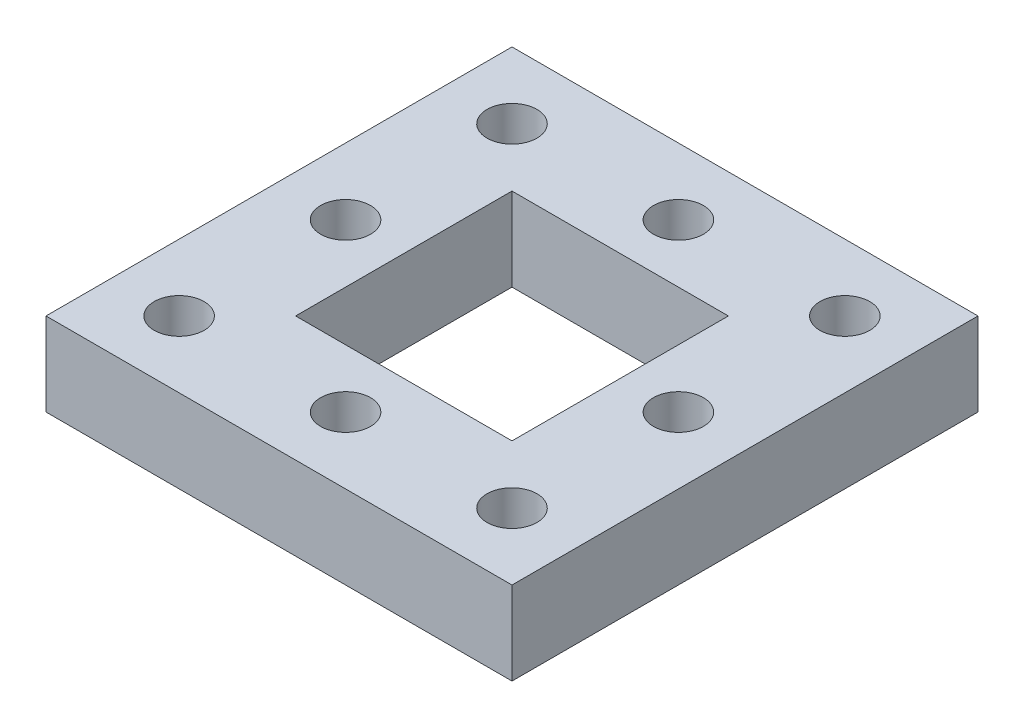
ISO-10303-21;
HEADER;
FILE_DESCRIPTION(('STEP AP214'),'2;1');
FILE_NAME('part.step','',(''),(''),'','','');
FILE_SCHEMA(('AUTOMOTIVE_DESIGN { 1 0 10303 214 1 1 1 1 }'));
ENDSEC;
DATA;
#1=APPLICATION_CONTEXT('core data for automotive mechanical design processes');
#2=APPLICATION_PROTOCOL_DEFINITION('international standard','automotive_design',2000,#1);
#3=PRODUCT_CONTEXT('',#1,'mechanical');
#4=PRODUCT('Part','Part','',(#3));
#5=PRODUCT_RELATED_PRODUCT_CATEGORY('part','',(#4));
#6=PRODUCT_DEFINITION_FORMATION('','',#4);
#7=PRODUCT_DEFINITION_CONTEXT('part definition',#1,'design');
#8=PRODUCT_DEFINITION('design','',#6,#7);
#9=PRODUCT_DEFINITION_SHAPE('','',#8);
#10=(LENGTH_UNIT() NAMED_UNIT(*) SI_UNIT(.MILLI.,.METRE.));
#11=(NAMED_UNIT(*) PLANE_ANGLE_UNIT() SI_UNIT($,.RADIAN.));
#12=(NAMED_UNIT(*) SI_UNIT($,.STERADIAN.) SOLID_ANGLE_UNIT());
#13=UNCERTAINTY_MEASURE_WITH_UNIT(LENGTH_MEASURE(1.E-05),#10,'distance_accuracy_value','');
#14=(GEOMETRIC_REPRESENTATION_CONTEXT(3) GLOBAL_UNCERTAINTY_ASSIGNED_CONTEXT((#13)) GLOBAL_UNIT_ASSIGNED_CONTEXT((#10,
#11,#12)) REPRESENTATION_CONTEXT('',''));
#15=CARTESIAN_POINT('',(0.,0.,0.));
#16=DIRECTION('',(0.,0.,1.));
#17=DIRECTION('',(1.,0.,0.));
#18=AXIS2_PLACEMENT_3D('',#15,#16,#17);
#19=CARTESIAN_POINT('',(0.,5.,0.));
#20=DIRECTION('',(0.,-1.,0.));
#21=DIRECTION('',(0.,0.,-1.));
#22=AXIS2_PLACEMENT_3D('',#19,#20,#21);
#23=PLANE('',#22);
#24=CARTESIAN_POINT('',(14.,5.,-4.));
#25=DIRECTION('',(0.,1.,0.));
#26=DIRECTION('',(0.,0.,1.));
#27=AXIS2_PLACEMENT_3D('',#24,#25,#26);
#28=CIRCLE('',#27,1.5);
#29=CARTESIAN_POINT('',(14.,5.,-2.5));
#30=VERTEX_POINT('',#29);
#31=EDGE_CURVE('E255',#30,#30,#28,.T.);
#32=ORIENTED_EDGE('',*,*,#31,.F.);
#33=EDGE_LOOP('',(#32));
#34=FACE_BOUND('',#33,.T.);
#35=CARTESIAN_POINT('',(4.00000000000001,5.,-14.));
#36=DIRECTION('',(0.,1.,0.));
#37=DIRECTION('',(0.,0.,1.));
#38=AXIS2_PLACEMENT_3D('',#35,#36,#37);
#39=CIRCLE('',#38,1.5);
#40=CARTESIAN_POINT('',(4.00000000000001,5.,-12.5));
#41=VERTEX_POINT('',#40);
#42=EDGE_CURVE('E257',#41,#41,#39,.T.);
#43=ORIENTED_EDGE('',*,*,#42,.F.);
#44=EDGE_LOOP('',(#43));
#45=FACE_BOUND('',#44,.T.);
#46=CARTESIAN_POINT('',(14.,5.,-24.));
#47=DIRECTION('',(0.,1.,0.));
#48=DIRECTION('',(0.,0.,1.));
#49=AXIS2_PLACEMENT_3D('',#46,#47,#48);
#50=CIRCLE('',#49,1.5);
#51=CARTESIAN_POINT('',(14.,5.,-22.5));
#52=VERTEX_POINT('',#51);
#53=EDGE_CURVE('E263',#52,#52,#50,.T.);
#54=ORIENTED_EDGE('',*,*,#53,.F.);
#55=EDGE_LOOP('',(#54));
#56=FACE_BOUND('',#55,.T.);
#57=CARTESIAN_POINT('',(24.,5.,-14.));
#58=DIRECTION('',(0.,1.,0.));
#59=DIRECTION('',(0.,0.,1.));
#60=AXIS2_PLACEMENT_3D('',#57,#58,#59);
#61=CIRCLE('',#60,1.5);
#62=CARTESIAN_POINT('',(24.,5.,-12.5));
#63=VERTEX_POINT('',#62);
#64=EDGE_CURVE('E269',#63,#63,#61,.T.);
#65=ORIENTED_EDGE('',*,*,#64,.F.);
#66=EDGE_LOOP('',(#65));
#67=FACE_BOUND('',#66,.T.);
#68=CARTESIAN_POINT('',(24.,5.,-4.));
#69=DIRECTION('',(0.,1.,0.));
#70=DIRECTION('',(0.,0.,1.));
#71=AXIS2_PLACEMENT_3D('',#68,#69,#70);
#72=CIRCLE('',#71,1.5);
#73=CARTESIAN_POINT('',(24.,5.,-2.5));
#74=VERTEX_POINT('',#73);
#75=EDGE_CURVE('E275',#74,#74,#72,.T.);
#76=ORIENTED_EDGE('',*,*,#75,.F.);
#77=EDGE_LOOP('',(#76));
#78=FACE_BOUND('',#77,.T.);
#79=CARTESIAN_POINT('',(4.00000000000001,5.,-4.));
#80=DIRECTION('',(0.,1.,0.));
#81=DIRECTION('',(0.,0.,1.));
#82=AXIS2_PLACEMENT_3D('',#79,#80,#81);
#83=CIRCLE('',#82,1.5);
#84=CARTESIAN_POINT('',(4.00000000000001,5.,-2.5));
#85=VERTEX_POINT('',#84);
#86=EDGE_CURVE('E281',#85,#85,#83,.T.);
#87=ORIENTED_EDGE('',*,*,#86,.F.);
#88=EDGE_LOOP('',(#87));
#89=FACE_BOUND('',#88,.T.);
#90=CARTESIAN_POINT('',(4.00000000000001,5.,-24.));
#91=DIRECTION('',(0.,1.,0.));
#92=DIRECTION('',(0.,0.,1.));
#93=AXIS2_PLACEMENT_3D('',#90,#91,#92);
#94=CIRCLE('',#93,1.5);
#95=CARTESIAN_POINT('',(4.00000000000001,5.,-22.5));
#96=VERTEX_POINT('',#95);
#97=EDGE_CURVE('E287',#96,#96,#94,.T.);
#98=ORIENTED_EDGE('',*,*,#97,.F.);
#99=EDGE_LOOP('',(#98));
#100=FACE_BOUND('',#99,.T.);
#101=CARTESIAN_POINT('',(24.,5.,-24.));
#102=DIRECTION('',(0.,1.,0.));
#103=DIRECTION('',(0.,0.,1.));
#104=AXIS2_PLACEMENT_3D('',#101,#102,#103);
#105=CIRCLE('',#104,1.5);
#106=CARTESIAN_POINT('',(24.,5.,-22.5));
#107=VERTEX_POINT('',#106);
#108=EDGE_CURVE('E293',#107,#107,#105,.T.);
#109=ORIENTED_EDGE('',*,*,#108,.F.);
#110=EDGE_LOOP('',(#109));
#111=FACE_BOUND('',#110,.T.);
#112=DIRECTION('',(0.,0.,1.));
#113=VECTOR('',#112,1.);
#114=CARTESIAN_POINT('',(0.,5.,0.));
#115=LINE('',#114,#113);
#116=CARTESIAN_POINT('',(0.,5.,-28.));
#117=VERTEX_POINT('',#116);
#118=CARTESIAN_POINT('',(0.,5.,0.));
#119=VERTEX_POINT('',#118);
#120=EDGE_CURVE('E137',#117,#119,#115,.T.);
#121=ORIENTED_EDGE('',*,*,#120,.T.);
#122=DIRECTION('',(1.,0.,0.));
#123=VECTOR('',#122,1.);
#124=CARTESIAN_POINT('',(0.,5.,0.));
#125=LINE('',#124,#123);
#126=CARTESIAN_POINT('',(28.,5.,0.));
#127=VERTEX_POINT('',#126);
#128=EDGE_CURVE('E140',#119,#127,#125,.T.);
#129=ORIENTED_EDGE('',*,*,#128,.T.);
#130=DIRECTION('',(0.,0.,-1.));
#131=VECTOR('',#130,1.);
#132=CARTESIAN_POINT('',(28.,5.,0.));
#133=LINE('',#132,#131);
#134=CARTESIAN_POINT('',(28.,5.,-28.));
#135=VERTEX_POINT('',#134);
#136=EDGE_CURVE('E143',#127,#135,#133,.T.);
#137=ORIENTED_EDGE('',*,*,#136,.T.);
#138=DIRECTION('',(-1.,0.,0.));
#139=VECTOR('',#138,1.);
#140=CARTESIAN_POINT('',(0.,5.,-28.));
#141=LINE('',#140,#139);
#142=EDGE_CURVE('E145',#135,#117,#141,.T.);
#143=ORIENTED_EDGE('',*,*,#142,.T.);
#144=EDGE_LOOP('',(#121,#129,#137,#143));
#145=FACE_BOUND('',#144,.T.);
#146=DIRECTION('',(0.,0.,1.));
#147=VECTOR('',#146,1.);
#148=CARTESIAN_POINT('',(7.5,5.,-20.5));
#149=LINE('',#148,#147);
#150=CARTESIAN_POINT('',(7.5,5.,-20.5));
#151=VERTEX_POINT('',#150);
#152=CARTESIAN_POINT('',(7.5,5.,-7.5));
#153=VERTEX_POINT('',#152);
#154=EDGE_CURVE('E99',#151,#153,#149,.T.);
#155=ORIENTED_EDGE('',*,*,#154,.F.);
#156=DIRECTION('',(-1.,0.,0.));
#157=VECTOR('',#156,1.);
#158=CARTESIAN_POINT('',(7.5,5.,-20.5));
#159=LINE('',#158,#157);
#160=CARTESIAN_POINT('',(20.5,5.,-20.5));
#161=VERTEX_POINT('',#160);
#162=EDGE_CURVE('E121',#161,#151,#159,.T.);
#163=ORIENTED_EDGE('',*,*,#162,.F.);
#164=DIRECTION('',(0.,0.,-1.));
#165=VECTOR('',#164,1.);
#166=CARTESIAN_POINT('',(20.5,5.,-20.5));
#167=LINE('',#166,#165);
#168=CARTESIAN_POINT('',(20.5,5.,-7.5));
#169=VERTEX_POINT('',#168);
#170=EDGE_CURVE('E119',#169,#161,#167,.T.);
#171=ORIENTED_EDGE('',*,*,#170,.F.);
#172=DIRECTION('',(1.,0.,0.));
#173=VECTOR('',#172,1.);
#174=CARTESIAN_POINT('',(7.5,5.,-7.5));
#175=LINE('',#174,#173);
#176=EDGE_CURVE('E107',#153,#169,#175,.T.);
#177=ORIENTED_EDGE('',*,*,#176,.F.);
#178=EDGE_LOOP('',(#155,#163,#171,#177));
#179=FACE_BOUND('',#178,.T.);
#180=ADVANCED_FACE('F34',(#34,#45,#56,#67,#78,#89,#100,#111,#145,#179),#23,.F.);
#181=CARTESIAN_POINT('',(0.,0.,0.));
#182=DIRECTION('',(0.,-1.,0.));
#183=DIRECTION('',(0.,0.,-1.));
#184=AXIS2_PLACEMENT_3D('',#181,#182,#183);
#185=PLANE('',#184);
#186=CARTESIAN_POINT('',(14.,0.,-4.));
#187=DIRECTION('',(0.,1.,0.));
#188=DIRECTION('',(0.,0.,1.));
#189=AXIS2_PLACEMENT_3D('',#186,#187,#188);
#190=CIRCLE('',#189,1.5);
#191=CARTESIAN_POINT('',(14.,0.,-2.5));
#192=VERTEX_POINT('',#191);
#193=EDGE_CURVE('E253',#192,#192,#190,.T.);
#194=ORIENTED_EDGE('',*,*,#193,.T.);
#195=EDGE_LOOP('',(#194));
#196=FACE_BOUND('',#195,.T.);
#197=CARTESIAN_POINT('',(4.00000000000001,0.,-14.));
#198=DIRECTION('',(0.,1.,0.));
#199=DIRECTION('',(0.,0.,1.));
#200=AXIS2_PLACEMENT_3D('',#197,#198,#199);
#201=CIRCLE('',#200,1.5);
#202=CARTESIAN_POINT('',(4.00000000000001,0.,-12.5));
#203=VERTEX_POINT('',#202);
#204=EDGE_CURVE('E260',#203,#203,#201,.T.);
#205=ORIENTED_EDGE('',*,*,#204,.T.);
#206=EDGE_LOOP('',(#205));
#207=FACE_BOUND('',#206,.T.);
#208=CARTESIAN_POINT('',(14.,0.,-24.));
#209=DIRECTION('',(0.,1.,0.));
#210=DIRECTION('',(0.,0.,1.));
#211=AXIS2_PLACEMENT_3D('',#208,#209,#210);
#212=CIRCLE('',#211,1.5);
#213=CARTESIAN_POINT('',(14.,0.,-22.5));
#214=VERTEX_POINT('',#213);
#215=EDGE_CURVE('E266',#214,#214,#212,.T.);
#216=ORIENTED_EDGE('',*,*,#215,.T.);
#217=EDGE_LOOP('',(#216));
#218=FACE_BOUND('',#217,.T.);
#219=CARTESIAN_POINT('',(24.,0.,-14.));
#220=DIRECTION('',(0.,1.,0.));
#221=DIRECTION('',(0.,0.,1.));
#222=AXIS2_PLACEMENT_3D('',#219,#220,#221);
#223=CIRCLE('',#222,1.5);
#224=CARTESIAN_POINT('',(24.,0.,-12.5));
#225=VERTEX_POINT('',#224);
#226=EDGE_CURVE('E272',#225,#225,#223,.T.);
#227=ORIENTED_EDGE('',*,*,#226,.T.);
#228=EDGE_LOOP('',(#227));
#229=FACE_BOUND('',#228,.T.);
#230=CARTESIAN_POINT('',(24.,0.,-4.));
#231=DIRECTION('',(0.,1.,0.));
#232=DIRECTION('',(0.,0.,1.));
#233=AXIS2_PLACEMENT_3D('',#230,#231,#232);
#234=CIRCLE('',#233,1.5);
#235=CARTESIAN_POINT('',(24.,0.,-2.5));
#236=VERTEX_POINT('',#235);
#237=EDGE_CURVE('E278',#236,#236,#234,.T.);
#238=ORIENTED_EDGE('',*,*,#237,.T.);
#239=EDGE_LOOP('',(#238));
#240=FACE_BOUND('',#239,.T.);
#241=CARTESIAN_POINT('',(4.00000000000001,0.,-4.));
#242=DIRECTION('',(0.,1.,0.));
#243=DIRECTION('',(0.,0.,1.));
#244=AXIS2_PLACEMENT_3D('',#241,#242,#243);
#245=CIRCLE('',#244,1.5);
#246=CARTESIAN_POINT('',(4.00000000000001,0.,-2.5));
#247=VERTEX_POINT('',#246);
#248=EDGE_CURVE('E284',#247,#247,#245,.T.);
#249=ORIENTED_EDGE('',*,*,#248,.T.);
#250=EDGE_LOOP('',(#249));
#251=FACE_BOUND('',#250,.T.);
#252=CARTESIAN_POINT('',(4.00000000000001,0.,-24.));
#253=DIRECTION('',(0.,1.,0.));
#254=DIRECTION('',(0.,0.,1.));
#255=AXIS2_PLACEMENT_3D('',#252,#253,#254);
#256=CIRCLE('',#255,1.5);
#257=CARTESIAN_POINT('',(4.00000000000001,0.,-22.5));
#258=VERTEX_POINT('',#257);
#259=EDGE_CURVE('E290',#258,#258,#256,.T.);
#260=ORIENTED_EDGE('',*,*,#259,.T.);
#261=EDGE_LOOP('',(#260));
#262=FACE_BOUND('',#261,.T.);
#263=CARTESIAN_POINT('',(24.,0.,-24.));
#264=DIRECTION('',(0.,1.,0.));
#265=DIRECTION('',(0.,0.,1.));
#266=AXIS2_PLACEMENT_3D('',#263,#264,#265);
#267=CIRCLE('',#266,1.5);
#268=CARTESIAN_POINT('',(24.,0.,-22.5));
#269=VERTEX_POINT('',#268);
#270=EDGE_CURVE('E127',#269,#269,#267,.T.);
#271=ORIENTED_EDGE('',*,*,#270,.T.);
#272=EDGE_LOOP('',(#271));
#273=FACE_BOUND('',#272,.T.);
#274=DIRECTION('',(0.,0.,1.));
#275=VECTOR('',#274,1.);
#276=CARTESIAN_POINT('',(0.,0.,0.));
#277=LINE('',#276,#275);
#278=CARTESIAN_POINT('',(0.,0.,-28.));
#279=VERTEX_POINT('',#278);
#280=CARTESIAN_POINT('',(0.,0.,0.));
#281=VERTEX_POINT('',#280);
#282=EDGE_CURVE('E115',#279,#281,#277,.T.);
#283=ORIENTED_EDGE('',*,*,#282,.F.);
#284=DIRECTION('',(-1.,0.,0.));
#285=VECTOR('',#284,1.);
#286=CARTESIAN_POINT('',(0.,0.,-28.));
#287=LINE('',#286,#285);
#288=CARTESIAN_POINT('',(28.,0.,-28.));
#289=VERTEX_POINT('',#288);
#290=EDGE_CURVE('E141',#289,#279,#287,.T.);
#291=ORIENTED_EDGE('',*,*,#290,.F.);
#292=DIRECTION('',(0.,0.,-1.));
#293=VECTOR('',#292,1.);
#294=CARTESIAN_POINT('',(28.,0.,0.));
#295=LINE('',#294,#293);
#296=CARTESIAN_POINT('',(28.,0.,0.));
#297=VERTEX_POINT('',#296);
#298=EDGE_CURVE('E152',#297,#289,#295,.T.);
#299=ORIENTED_EDGE('',*,*,#298,.F.);
#300=DIRECTION('',(1.,0.,0.));
#301=VECTOR('',#300,1.);
#302=CARTESIAN_POINT('',(0.,0.,0.));
#303=LINE('',#302,#301);
#304=EDGE_CURVE('E150',#281,#297,#303,.T.);
#305=ORIENTED_EDGE('',*,*,#304,.F.);
#306=EDGE_LOOP('',(#283,#291,#299,#305));
#307=FACE_BOUND('',#306,.T.);
#308=DIRECTION('',(-1.,0.,0.));
#309=VECTOR('',#308,1.);
#310=CARTESIAN_POINT('',(7.5,0.,-20.5));
#311=LINE('',#310,#309);
#312=CARTESIAN_POINT('',(20.5,0.,-20.5));
#313=VERTEX_POINT('',#312);
#314=CARTESIAN_POINT('',(7.5,0.,-20.5));
#315=VERTEX_POINT('',#314);
#316=EDGE_CURVE('E108',#313,#315,#311,.T.);
#317=ORIENTED_EDGE('',*,*,#316,.T.);
#318=DIRECTION('',(0.,0.,1.));
#319=VECTOR('',#318,1.);
#320=CARTESIAN_POINT('',(7.5,0.,-20.5));
#321=LINE('',#320,#319);
#322=CARTESIAN_POINT('',(7.5,0.,-7.5));
#323=VERTEX_POINT('',#322);
#324=EDGE_CURVE('E57',#315,#323,#321,.T.);
#325=ORIENTED_EDGE('',*,*,#324,.T.);
#326=DIRECTION('',(1.,0.,0.));
#327=VECTOR('',#326,1.);
#328=CARTESIAN_POINT('',(7.5,0.,-7.5));
#329=LINE('',#328,#327);
#330=CARTESIAN_POINT('',(20.5,0.,-7.5));
#331=VERTEX_POINT('',#330);
#332=EDGE_CURVE('E114',#323,#331,#329,.T.);
#333=ORIENTED_EDGE('',*,*,#332,.T.);
#334=DIRECTION('',(0.,0.,-1.));
#335=VECTOR('',#334,1.);
#336=CARTESIAN_POINT('',(20.5,0.,-20.5));
#337=LINE('',#336,#335);
#338=EDGE_CURVE('E129',#331,#313,#337,.T.);
#339=ORIENTED_EDGE('',*,*,#338,.T.);
#340=EDGE_LOOP('',(#317,#325,#333,#339));
#341=FACE_BOUND('',#340,.T.);
#342=ADVANCED_FACE('F170',(#196,#207,#218,#229,#240,#251,#262,#273,#307,#341),#185,.T.);
#343=CARTESIAN_POINT('',(0.,5.,0.));
#344=DIRECTION('',(1.,0.,0.));
#345=DIRECTION('',(0.,0.,-1.));
#346=AXIS2_PLACEMENT_3D('',#343,#344,#345);
#347=PLANE('',#346);
#348=ORIENTED_EDGE('',*,*,#282,.T.);
#349=DIRECTION('',(0.,-1.,0.));
#350=VECTOR('',#349,1.);
#351=CARTESIAN_POINT('',(0.,5.,0.));
#352=LINE('',#351,#350);
#353=EDGE_CURVE('E11',#119,#281,#352,.T.);
#354=ORIENTED_EDGE('',*,*,#353,.F.);
#355=ORIENTED_EDGE('',*,*,#120,.F.);
#356=DIRECTION('',(0.,-1.,0.));
#357=VECTOR('',#356,1.);
#358=CARTESIAN_POINT('',(0.,5.,-28.));
#359=LINE('',#358,#357);
#360=EDGE_CURVE('E147',#117,#279,#359,.T.);
#361=ORIENTED_EDGE('',*,*,#360,.T.);
#362=EDGE_LOOP('',(#348,#354,#355,#361));
#363=FACE_BOUND('',#362,.T.);
#364=ADVANCED_FACE('F36',(#363),#347,.F.);
#365=CARTESIAN_POINT('',(0.,5.,0.));
#366=DIRECTION('',(0.,0.,-1.));
#367=DIRECTION('',(-1.,0.,0.));
#368=AXIS2_PLACEMENT_3D('',#365,#366,#367);
#369=PLANE('',#368);
#370=ORIENTED_EDGE('',*,*,#304,.T.);
#371=DIRECTION('',(0.,-1.,0.));
#372=VECTOR('',#371,1.);
#373=CARTESIAN_POINT('',(28.,5.,0.));
#374=LINE('',#373,#372);
#375=EDGE_CURVE('E42',#127,#297,#374,.T.);
#376=ORIENTED_EDGE('',*,*,#375,.F.);
#377=ORIENTED_EDGE('',*,*,#128,.F.);
#378=ORIENTED_EDGE('',*,*,#353,.T.);
#379=EDGE_LOOP('',(#370,#376,#377,#378));
#380=FACE_BOUND('',#379,.T.);
#381=ADVANCED_FACE('F180',(#380),#369,.F.);
#382=CARTESIAN_POINT('',(28.,5.,0.));
#383=DIRECTION('',(-1.,0.,0.));
#384=DIRECTION('',(0.,0.,1.));
#385=AXIS2_PLACEMENT_3D('',#382,#383,#384);
#386=PLANE('',#385);
#387=ORIENTED_EDGE('',*,*,#298,.T.);
#388=DIRECTION('',(0.,-1.,0.));
#389=VECTOR('',#388,1.);
#390=CARTESIAN_POINT('',(28.,5.,-28.));
#391=LINE('',#390,#389);
#392=EDGE_CURVE('E157',#135,#289,#391,.T.);
#393=ORIENTED_EDGE('',*,*,#392,.F.);
#394=ORIENTED_EDGE('',*,*,#136,.F.);
#395=ORIENTED_EDGE('',*,*,#375,.T.);
#396=EDGE_LOOP('',(#387,#393,#394,#395));
#397=FACE_BOUND('',#396,.T.);
#398=ADVANCED_FACE('F164',(#397),#386,.F.);
#399=CARTESIAN_POINT('',(0.,5.,-28.));
#400=DIRECTION('',(0.,0.,1.));
#401=DIRECTION('',(1.,0.,0.));
#402=AXIS2_PLACEMENT_3D('',#399,#400,#401);
#403=PLANE('',#402);
#404=ORIENTED_EDGE('',*,*,#290,.T.);
#405=ORIENTED_EDGE('',*,*,#360,.F.);
#406=ORIENTED_EDGE('',*,*,#142,.F.);
#407=ORIENTED_EDGE('',*,*,#392,.T.);
#408=EDGE_LOOP('',(#404,#405,#406,#407));
#409=FACE_BOUND('',#408,.T.);
#410=ADVANCED_FACE('F174',(#409),#403,.F.);
#411=CARTESIAN_POINT('',(7.5,5.,-20.5));
#412=DIRECTION('',(1.,0.,0.));
#413=DIRECTION('',(0.,0.,-1.));
#414=AXIS2_PLACEMENT_3D('',#411,#412,#413);
#415=PLANE('',#414);
#416=ORIENTED_EDGE('',*,*,#324,.F.);
#417=DIRECTION('',(0.,-1.,0.));
#418=VECTOR('',#417,1.);
#419=CARTESIAN_POINT('',(7.5,5.,-20.5));
#420=LINE('',#419,#418);
#421=EDGE_CURVE('E103',#151,#315,#420,.T.);
#422=ORIENTED_EDGE('',*,*,#421,.F.);
#423=ORIENTED_EDGE('',*,*,#154,.T.);
#424=DIRECTION('',(0.,-1.,0.));
#425=VECTOR('',#424,1.);
#426=CARTESIAN_POINT('',(7.5,5.,-7.5));
#427=LINE('',#426,#425);
#428=EDGE_CURVE('E102',#153,#323,#427,.T.);
#429=ORIENTED_EDGE('',*,*,#428,.T.);
#430=EDGE_LOOP('',(#416,#422,#423,#429));
#431=FACE_BOUND('',#430,.T.);
#432=ADVANCED_FACE('F101',(#431),#415,.T.);
#433=CARTESIAN_POINT('',(7.5,5.,-7.5));
#434=DIRECTION('',(0.,0.,-1.));
#435=DIRECTION('',(-1.,0.,0.));
#436=AXIS2_PLACEMENT_3D('',#433,#434,#435);
#437=PLANE('',#436);
#438=ORIENTED_EDGE('',*,*,#332,.F.);
#439=ORIENTED_EDGE('',*,*,#428,.F.);
#440=ORIENTED_EDGE('',*,*,#176,.T.);
#441=DIRECTION('',(0.,-1.,0.));
#442=VECTOR('',#441,1.);
#443=CARTESIAN_POINT('',(20.5,5.,-7.5));
#444=LINE('',#443,#442);
#445=EDGE_CURVE('E116',#169,#331,#444,.T.);
#446=ORIENTED_EDGE('',*,*,#445,.T.);
#447=EDGE_LOOP('',(#438,#439,#440,#446));
#448=FACE_BOUND('',#447,.T.);
#449=ADVANCED_FACE('F111',(#448),#437,.T.);
#450=CARTESIAN_POINT('',(20.5,5.,-20.5));
#451=DIRECTION('',(-1.,0.,0.));
#452=DIRECTION('',(0.,0.,1.));
#453=AXIS2_PLACEMENT_3D('',#450,#451,#452);
#454=PLANE('',#453);
#455=ORIENTED_EDGE('',*,*,#338,.F.);
#456=ORIENTED_EDGE('',*,*,#445,.F.);
#457=ORIENTED_EDGE('',*,*,#170,.T.);
#458=DIRECTION('',(0.,-1.,0.));
#459=VECTOR('',#458,1.);
#460=CARTESIAN_POINT('',(20.5,5.,-20.5));
#461=LINE('',#460,#459);
#462=EDGE_CURVE('E49',#161,#313,#461,.T.);
#463=ORIENTED_EDGE('',*,*,#462,.T.);
#464=EDGE_LOOP('',(#455,#456,#457,#463));
#465=FACE_BOUND('',#464,.T.);
#466=ADVANCED_FACE('F207',(#465),#454,.T.);
#467=CARTESIAN_POINT('',(7.5,5.,-20.5));
#468=DIRECTION('',(0.,0.,1.));
#469=DIRECTION('',(1.,0.,0.));
#470=AXIS2_PLACEMENT_3D('',#467,#468,#469);
#471=PLANE('',#470);
#472=ORIENTED_EDGE('',*,*,#316,.F.);
#473=ORIENTED_EDGE('',*,*,#462,.F.);
#474=ORIENTED_EDGE('',*,*,#162,.T.);
#475=ORIENTED_EDGE('',*,*,#421,.T.);
#476=EDGE_LOOP('',(#472,#473,#474,#475));
#477=FACE_BOUND('',#476,.T.);
#478=ADVANCED_FACE('F211',(#477),#471,.T.);
#479=CARTESIAN_POINT('',(24.,0.,-24.));
#480=DIRECTION('',(0.,1.,0.));
#481=DIRECTION('',(0.,0.,1.));
#482=AXIS2_PLACEMENT_3D('',#479,#480,#481);
#483=CYLINDRICAL_SURFACE('',#482,1.5);
#484=ORIENTED_EDGE('',*,*,#270,.F.);
#485=EDGE_LOOP('',(#484));
#486=FACE_BOUND('',#485,.T.);
#487=ORIENTED_EDGE('',*,*,#108,.T.);
#488=EDGE_LOOP('',(#487));
#489=FACE_BOUND('',#488,.T.);
#490=ADVANCED_FACE('F217',(#486,#489),#483,.F.);
#491=CARTESIAN_POINT('',(4.00000000000001,0.,-24.));
#492=DIRECTION('',(0.,1.,0.));
#493=DIRECTION('',(0.,0.,1.));
#494=AXIS2_PLACEMENT_3D('',#491,#492,#493);
#495=CYLINDRICAL_SURFACE('',#494,1.5);
#496=ORIENTED_EDGE('',*,*,#259,.F.);
#497=EDGE_LOOP('',(#496));
#498=FACE_BOUND('',#497,.T.);
#499=ORIENTED_EDGE('',*,*,#97,.T.);
#500=EDGE_LOOP('',(#499));
#501=FACE_BOUND('',#500,.T.);
#502=ADVANCED_FACE('F220',(#498,#501),#495,.F.);
#503=CARTESIAN_POINT('',(4.00000000000001,0.,-4.));
#504=DIRECTION('',(0.,1.,0.));
#505=DIRECTION('',(0.,0.,1.));
#506=AXIS2_PLACEMENT_3D('',#503,#504,#505);
#507=CYLINDRICAL_SURFACE('',#506,1.5);
#508=ORIENTED_EDGE('',*,*,#248,.F.);
#509=EDGE_LOOP('',(#508));
#510=FACE_BOUND('',#509,.T.);
#511=ORIENTED_EDGE('',*,*,#86,.T.);
#512=EDGE_LOOP('',(#511));
#513=FACE_BOUND('',#512,.T.);
#514=ADVANCED_FACE('F224',(#510,#513),#507,.F.);
#515=CARTESIAN_POINT('',(24.,0.,-4.));
#516=DIRECTION('',(0.,1.,0.));
#517=DIRECTION('',(0.,0.,1.));
#518=AXIS2_PLACEMENT_3D('',#515,#516,#517);
#519=CYLINDRICAL_SURFACE('',#518,1.5);
#520=ORIENTED_EDGE('',*,*,#237,.F.);
#521=EDGE_LOOP('',(#520));
#522=FACE_BOUND('',#521,.T.);
#523=ORIENTED_EDGE('',*,*,#75,.T.);
#524=EDGE_LOOP('',(#523));
#525=FACE_BOUND('',#524,.T.);
#526=ADVANCED_FACE('F228',(#522,#525),#519,.F.);
#527=CARTESIAN_POINT('',(24.,0.,-14.));
#528=DIRECTION('',(0.,1.,0.));
#529=DIRECTION('',(0.,0.,1.));
#530=AXIS2_PLACEMENT_3D('',#527,#528,#529);
#531=CYLINDRICAL_SURFACE('',#530,1.5);
#532=ORIENTED_EDGE('',*,*,#226,.F.);
#533=EDGE_LOOP('',(#532));
#534=FACE_BOUND('',#533,.T.);
#535=ORIENTED_EDGE('',*,*,#64,.T.);
#536=EDGE_LOOP('',(#535));
#537=FACE_BOUND('',#536,.T.);
#538=ADVANCED_FACE('F232',(#534,#537),#531,.F.);
#539=CARTESIAN_POINT('',(14.,0.,-24.));
#540=DIRECTION('',(0.,1.,0.));
#541=DIRECTION('',(0.,0.,1.));
#542=AXIS2_PLACEMENT_3D('',#539,#540,#541);
#543=CYLINDRICAL_SURFACE('',#542,1.5);
#544=ORIENTED_EDGE('',*,*,#215,.F.);
#545=EDGE_LOOP('',(#544));
#546=FACE_BOUND('',#545,.T.);
#547=ORIENTED_EDGE('',*,*,#53,.T.);
#548=EDGE_LOOP('',(#547));
#549=FACE_BOUND('',#548,.T.);
#550=ADVANCED_FACE('F236',(#546,#549),#543,.F.);
#551=CARTESIAN_POINT('',(4.00000000000001,0.,-14.));
#552=DIRECTION('',(0.,1.,0.));
#553=DIRECTION('',(0.,0.,1.));
#554=AXIS2_PLACEMENT_3D('',#551,#552,#553);
#555=CYLINDRICAL_SURFACE('',#554,1.5);
#556=ORIENTED_EDGE('',*,*,#204,.F.);
#557=EDGE_LOOP('',(#556));
#558=FACE_BOUND('',#557,.T.);
#559=ORIENTED_EDGE('',*,*,#42,.T.);
#560=EDGE_LOOP('',(#559));
#561=FACE_BOUND('',#560,.T.);
#562=ADVANCED_FACE('F240',(#558,#561),#555,.F.);
#563=CARTESIAN_POINT('',(14.,0.,-4.));
#564=DIRECTION('',(0.,1.,0.));
#565=DIRECTION('',(0.,0.,1.));
#566=AXIS2_PLACEMENT_3D('',#563,#564,#565);
#567=CYLINDRICAL_SURFACE('',#566,1.5);
#568=ORIENTED_EDGE('',*,*,#193,.F.);
#569=EDGE_LOOP('',(#568));
#570=FACE_BOUND('',#569,.T.);
#571=ORIENTED_EDGE('',*,*,#31,.T.);
#572=EDGE_LOOP('',(#571));
#573=FACE_BOUND('',#572,.T.);
#574=ADVANCED_FACE('F244',(#570,#573),#567,.F.);
#575=CLOSED_SHELL('',(#180,#342,#364,#381,#398,#410,#432,#449,#466,#478,#490,#502,#514,#526,
#538,#550,#562,#574));
#576=MANIFOLD_SOLID_BREP('B2',#575);
#577=ADVANCED_BREP_SHAPE_REPRESENTATION('',(#18,#576),#14);
#578=SHAPE_DEFINITION_REPRESENTATION(#9,#577);
ENDSEC;
END-ISO-10303-21;
